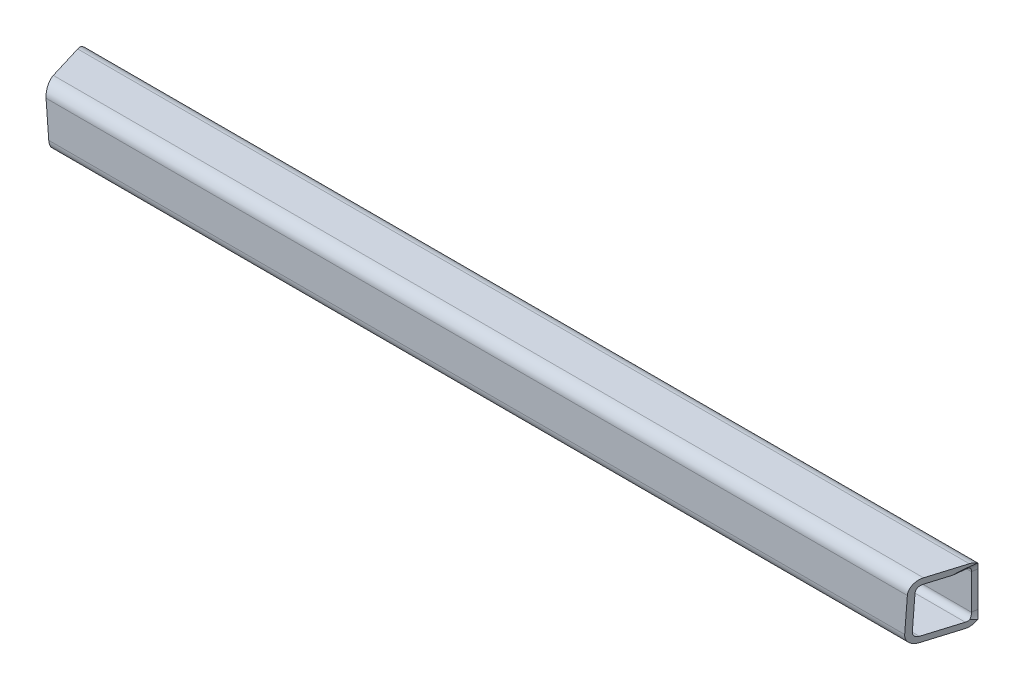
ISO-10303-21;
HEADER;
FILE_DESCRIPTION(('STEP AP214'),'2;1');
FILE_NAME('part.step','',(''),(''),'','','');
FILE_SCHEMA(('AUTOMOTIVE_DESIGN { 1 0 10303 214 1 1 1 1 }'));
ENDSEC;
DATA;
#1=APPLICATION_CONTEXT('core data for automotive mechanical design processes');
#2=APPLICATION_PROTOCOL_DEFINITION('international standard','automotive_design',2000,#1);
#3=PRODUCT_CONTEXT('',#1,'mechanical');
#4=PRODUCT('Part','Part','',(#3));
#5=PRODUCT_RELATED_PRODUCT_CATEGORY('part','',(#4));
#6=PRODUCT_DEFINITION_FORMATION('','',#4);
#7=PRODUCT_DEFINITION_CONTEXT('part definition',#1,'design');
#8=PRODUCT_DEFINITION('design','',#6,#7);
#9=PRODUCT_DEFINITION_SHAPE('','',#8);
#10=(LENGTH_UNIT() NAMED_UNIT(*) SI_UNIT(.MILLI.,.METRE.));
#11=(NAMED_UNIT(*) PLANE_ANGLE_UNIT() SI_UNIT($,.RADIAN.));
#12=(NAMED_UNIT(*) SI_UNIT($,.STERADIAN.) SOLID_ANGLE_UNIT());
#13=UNCERTAINTY_MEASURE_WITH_UNIT(LENGTH_MEASURE(1.E-05),#10,'distance_accuracy_value','');
#14=(GEOMETRIC_REPRESENTATION_CONTEXT(3) GLOBAL_UNCERTAINTY_ASSIGNED_CONTEXT((#13)) GLOBAL_UNIT_ASSIGNED_CONTEXT((#10,
#11,#12)) REPRESENTATION_CONTEXT('',''));
#15=CARTESIAN_POINT('',(0.,0.,0.));
#16=DIRECTION('',(0.,0.,1.));
#17=DIRECTION('',(1.,0.,0.));
#18=AXIS2_PLACEMENT_3D('',#15,#16,#17);
#19=CARTESIAN_POINT('',(-160.285714285715,6.00000000000003,-920.999999999999));
#20=DIRECTION('',(1.,0.,0.));
#21=DIRECTION('',(0.,1.,0.));
#22=AXIS2_PLACEMENT_3D('',#19,#20,#21);
#23=CYLINDRICAL_SURFACE('',#22,2.);
#24=DIRECTION('',(1.,0.,0.));
#25=VECTOR('',#24,1.);
#26=CARTESIAN_POINT('',(-160.285714285715,6.00000000000003,-922.999999999999));
#27=LINE('',#26,#25);
#28=CARTESIAN_POINT('',(-151.134905740681,6.00000000000001,-922.999999999999));
#29=VERTEX_POINT('',#28);
#30=CARTESIAN_POINT('',(151.13490574068,6.00000000000001,-922.999999999999));
#31=VERTEX_POINT('',#30);
#32=EDGE_CURVE('E226',#29,#31,#27,.T.);
#33=ORIENTED_EDGE('',*,*,#32,.T.);
#34=CARTESIAN_POINT('',(151.13490574068,6.00000000000001,-922.999999999999));
#35=CARTESIAN_POINT('',(151.134897059827,6.05419640564872,-923.00000751972));
#36=CARTESIAN_POINT('',(151.135762397031,6.10838772068273,-922.997797240482));
#37=CARTESIAN_POINT('',(151.139176480151,6.21634466272112,-922.988999579538));
#38=CARTESIAN_POINT('',(151.141724720267,6.27011041271801,-922.98241351298));
#39=CARTESIAN_POINT('',(151.148428023615,6.37664257140389,-922.964954042094));
#40=CARTESIAN_POINT('',(151.152577297065,6.42941187042656,-922.954096083372));
#41=CARTESIAN_POINT('',(151.162355513296,6.53376388752842,-922.928208961263));
#42=CARTESIAN_POINT('',(151.167984516834,6.58534655679074,-922.9131796266));
#43=CARTESIAN_POINT('',(151.186854651839,6.73771644841641,-922.862047647994));
#44=CARTESIAN_POINT('',(151.202090342615,6.83629511211455,-922.81987285929));
#45=CARTESIAN_POINT('',(151.236181038484,7.02499707587432,-922.720690858675));
#46=CARTESIAN_POINT('',(151.255039064201,7.1151132251054,-922.663671253645));
#47=CARTESIAN_POINT('',(151.295079291636,7.28857088229563,-922.533565402813));
#48=CARTESIAN_POINT('',(151.316326001025,7.3714658103511,-922.459902525123));
#49=CARTESIAN_POINT('',(151.357679010673,7.52413611556775,-922.299715109808));
#50=CARTESIAN_POINT('',(151.37778488278,7.59390658960106,-922.213185786973));
#51=CARTESIAN_POINT('',(151.41435947345,7.72046565481461,-922.026222269599));
#52=CARTESIAN_POINT('',(151.430694095417,7.77677758870827,-921.925436661786));
#53=CARTESIAN_POINT('',(151.455426889844,7.87139703455613,-921.714935880384));
#54=CARTESIAN_POINT('',(151.46383946791,7.90973716277423,-921.605237310595));
#55=CARTESIAN_POINT('',(151.469150778897,7.95877617584965,-921.412441799088));
#56=CARTESIAN_POINT('',(151.468635040142,7.97422767067173,-921.330606794626));
#57=CARTESIAN_POINT('',(151.463406923026,7.98969128993363,-921.207028806294));
#58=CARTESIAN_POINT('',(151.460915416117,7.99356021392647,-921.165642163092));
#59=CARTESIAN_POINT('',(151.454439009416,7.99871615520551,-921.082811844146));
#60=CARTESIAN_POINT('',(151.450453646466,8.00000237096007,-921.041368154691));
#61=CARTESIAN_POINT('',(151.445721087815,8.00000000000004,-920.999999999999));
#62=B_SPLINE_CURVE_WITH_KNOTS('',3,(#34,#35,#36,#37,#38,#39,#40,#41,#42,#43,#44,#45,#46,#47,#48,
#49,#50,#51,#52,#53,#54,#55,#56,#57,#58,#59,#60,#61),.UNSPECIFIED.,.F.,.F.,(4,2,2,2,2,2,2,2,2,2,
2,2,2,4),(0.,0.16252869645522,0.325008566785314,0.486906289594832,0.648810660860133,
0.972109124341931,1.29567836228111,1.63290689274576,1.97026115834366,2.31821291865465,
2.66553072757329,2.9145130908649,3.0393415756133,3.16420879432476),.UNSPECIFIED.);
#63=CARTESIAN_POINT('',(151.445721087815,8.00000000000004,-920.999999999999));
#64=VERTEX_POINT('',#63);
#65=EDGE_CURVE('E205',#31,#64,#62,.T.);
#66=ORIENTED_EDGE('',*,*,#65,.T.);
#67=DIRECTION('',(1.,0.,0.));
#68=VECTOR('',#67,1.);
#69=CARTESIAN_POINT('',(-160.285714285715,8.00000000000004,-920.999999999999));
#70=LINE('',#69,#68);
#71=CARTESIAN_POINT('',(-151.445721087815,8.00000000000004,-920.999999999999));
#72=VERTEX_POINT('',#71);
#73=EDGE_CURVE('E248',#72,#64,#70,.T.);
#74=ORIENTED_EDGE('',*,*,#73,.F.);
#75=CARTESIAN_POINT('',(-151.445721087815,8.00000000000004,-920.999999999999));
#76=CARTESIAN_POINT('',(-151.451517129834,8.00000903572294,-921.050589117872));
#77=CARTESIAN_POINT('',(-151.45618387766,7.99808071534614,-921.101305996992));
#78=CARTESIAN_POINT('',(-151.463283833278,7.99035879422783,-921.202585899075));
#79=CARTESIAN_POINT('',(-151.465717731673,7.98456638957483,-921.253148964786));
#80=CARTESIAN_POINT('',(-151.46837394052,7.96916428843077,-921.353492426546));
#81=CARTESIAN_POINT('',(-151.468607236734,7.95957380313401,-921.403275470431));
#82=CARTESIAN_POINT('',(-151.467019091782,7.93665621860682,-921.501927058206));
#83=CARTESIAN_POINT('',(-151.465197604561,7.92332903562757,-921.550795581575));
#84=CARTESIAN_POINT('',(-151.456913414074,7.87791364263258,-921.695428266285));
#85=CARTESIAN_POINT('',(-151.447634232296,7.84036617809091,-921.789383599776));
#86=CARTESIAN_POINT('',(-151.423542569026,7.75191664238408,-921.970020905703));
#87=CARTESIAN_POINT('',(-151.40872378646,7.70099938331442,-922.056694457378));
#88=CARTESIAN_POINT('',(-151.374955334016,7.58407292875091,-922.225481719183));
#89=CARTESIAN_POINT('',(-151.35582626498,7.51739897642207,-922.307098967391));
#90=CARTESIAN_POINT('',(-151.316561960971,7.37222994092314,-922.458772455435));
#91=CARTESIAN_POINT('',(-151.296426360285,7.29373053992197,-922.528824452782));
#92=CARTESIAN_POINT('',(-151.255880556745,7.11941127015457,-922.661288941842));
#93=CARTESIAN_POINT('',(-151.235590590544,7.0226887595338,-922.722557778644));
#94=CARTESIAN_POINT('',(-151.19926992651,6.81963269905309,-922.827914254527));
#95=CARTESIAN_POINT('',(-151.183235820798,6.71330693100691,-922.872015653719));
#96=CARTESIAN_POINT('',(-151.158965838382,6.50668154994383,-922.93742129344));
#97=CARTESIAN_POINT('',(-151.150040247101,6.40711762998516,-922.96077927195));
#98=CARTESIAN_POINT('',(-151.141012619842,6.25567479995235,-922.984252763148));
#99=CARTESIAN_POINT('',(-151.13873006506,6.20476261841694,-922.990150138339));
#100=CARTESIAN_POINT('',(-151.135674170797,6.10257436977137,-922.998025381361));
#101=CARTESIAN_POINT('',(-151.134901330089,6.05129818801775,-923.000001953857));
#102=CARTESIAN_POINT('',(-151.134905740681,6.00000000000001,-922.999999999999));
#103=B_SPLINE_CURVE_WITH_KNOTS('',3,(#75,#76,#77,#78,#79,#80,#81,#82,#83,#84,#85,#86,#87,#88,
#89,#90,#91,#92,#93,#94,#95,#96,#97,#98,#99,#100,#101,#102),.UNSPECIFIED.,.F.,.F.,(4,2,2,2,2,2,
2,2,2,2,2,2,2,4),(0.,0.152708033212283,0.305368819104958,0.45726709191222,0.609168769414979,
0.912480430850225,1.21613815216217,1.53613858551101,1.85625614523143,2.20338957179243,
2.55024418688331,2.85678919151711,3.01054619178082,3.16435398099613),.UNSPECIFIED.);
#104=EDGE_CURVE('E338',#72,#29,#103,.T.);
#105=ORIENTED_EDGE('',*,*,#104,.T.);
#106=EDGE_LOOP('',(#33,#66,#74,#105));
#107=FACE_BOUND('',#106,.T.);
#108=ADVANCED_FACE('F41',(#107),#23,.F.);
#109=CARTESIAN_POINT('',(-160.285714285715,6.00000000000003,-920.999999999999));
#110=DIRECTION('',(1.,0.,0.));
#111=DIRECTION('',(0.,1.,0.));
#112=AXIS2_PLACEMENT_3D('',#109,#110,#111);
#113=CYLINDRICAL_SURFACE('',#112,4.);
#114=CARTESIAN_POINT('',(154.932372015837,6.00000000000002,-920.999999999999));
#115=DIRECTION('',(0.74617243019316,0.,-0.665752735195008));
#116=DIRECTION('',(0.665752735195008,0.,0.74617243019316));
#117=AXIS2_PLACEMENT_3D('',#114,#115,#116);
#118=ELLIPSE('',#117,5.36069122650985,4.);
#119=CARTESIAN_POINT('',(151.363477169252,6.00000000000001,-924.999999999999));
#120=VERTEX_POINT('',#119);
#121=CARTESIAN_POINT('',(153.006385328775,9.36753446588342,-923.158636518982));
#122=VERTEX_POINT('',#121);
#123=EDGE_CURVE('E274',#120,#122,#118,.T.);
#124=ORIENTED_EDGE('',*,*,#123,.F.);
#125=DIRECTION('',(1.,0.,0.));
#126=VECTOR('',#125,1.);
#127=CARTESIAN_POINT('',(-160.285714285715,6.00000000000003,-924.999999999999));
#128=LINE('',#127,#126);
#129=CARTESIAN_POINT('',(-151.363477169252,6.00000000000001,-925.));
#130=VERTEX_POINT('',#129);
#131=EDGE_CURVE('E204',#130,#120,#128,.T.);
#132=ORIENTED_EDGE('',*,*,#131,.F.);
#133=CARTESIAN_POINT('',(-154.932372015837,6.00000000000002,-920.999999999999));
#134=DIRECTION('',(0.74617243019316,0.,0.665752735195008));
#135=DIRECTION('',(0.665752735195008,0.,-0.74617243019316));
#136=AXIS2_PLACEMENT_3D('',#133,#134,#135);
#137=ELLIPSE('',#136,5.36069122650985,4.);
#138=CARTESIAN_POINT('',(-153.006385328775,9.36753446588327,-923.158636518983));
#139=VERTEX_POINT('',#138);
#140=EDGE_CURVE('E345',#139,#130,#137,.F.);
#141=ORIENTED_EDGE('',*,*,#140,.F.);
#142=CARTESIAN_POINT('',(-152.091058034834,6.00000000000003,-920.999999999999));
#143=DIRECTION('',(-0.954065398667244,-0.0730777748475656,0.29054922799629));
#144=DIRECTION('',(0.299598423003046,-0.232714764299507,0.925248411731203));
#145=AXIS2_PLACEMENT_3D('',#142,#143,#144);
#146=ELLIPSE('',#145,4.19258470707322,4.);
#147=CARTESIAN_POINT('',(-152.397442796087,10.,-920.999999999999));
#148=VERTEX_POINT('',#147);
#149=EDGE_CURVE('E230',#148,#139,#146,.T.);
#150=ORIENTED_EDGE('',*,*,#149,.F.);
#151=DIRECTION('',(1.,0.,0.));
#152=VECTOR('',#151,1.);
#153=CARTESIAN_POINT('',(-160.285714285715,10.,-920.999999999999));
#154=LINE('',#153,#152);
#155=CARTESIAN_POINT('',(152.397442796087,10.,-920.999999999999));
#156=VERTEX_POINT('',#155);
#157=EDGE_CURVE('E213',#148,#156,#154,.T.);
#158=ORIENTED_EDGE('',*,*,#157,.T.);
#159=CARTESIAN_POINT('',(152.091058034834,6.00000000000003,-920.999999999999));
#160=DIRECTION('',(0.954065398667245,-0.0730777748475653,0.290549227996289));
#161=DIRECTION('',(0.299598423003044,0.232714764299507,-0.925248411731203));
#162=AXIS2_PLACEMENT_3D('',#159,#160,#161);
#163=ELLIPSE('',#162,4.19258470707322,4.);
#164=EDGE_CURVE('E283',#122,#156,#163,.T.);
#165=ORIENTED_EDGE('',*,*,#164,.F.);
#166=EDGE_LOOP('',(#124,#132,#141,#150,#158,#165));
#167=FACE_BOUND('',#166,.T.);
#168=ADVANCED_FACE('F425',(#167),#113,.T.);
#169=CARTESIAN_POINT('',(-160.285714285715,-5.99999999999998,-920.999999999999));
#170=DIRECTION('',(1.,0.,0.));
#171=DIRECTION('',(0.,1.,0.));
#172=AXIS2_PLACEMENT_3D('',#169,#170,#171);
#173=CYLINDRICAL_SURFACE('',#172,4.);
#174=CARTESIAN_POINT('',(154.932372015837,-5.99999999999999,-920.999999999999));
#175=DIRECTION('',(0.74617243019316,0.,-0.665752735195008));
#176=DIRECTION('',(0.665752735195008,0.,0.74617243019316));
#177=AXIS2_PLACEMENT_3D('',#174,#175,#176);
#178=ELLIPSE('',#177,5.36069122650985,4.);
#179=CARTESIAN_POINT('',(151.998741926291,-8.27795234068853,-924.287998347558));
#180=VERTEX_POINT('',#179);
#181=CARTESIAN_POINT('',(151.363477169252,-6.00000000000001,-924.999999999999));
#182=VERTEX_POINT('',#181);
#183=EDGE_CURVE('E178',#180,#182,#178,.T.);
#184=ORIENTED_EDGE('',*,*,#183,.F.);
#185=CARTESIAN_POINT('',(151.171903751076,-5.99999999999998,-920.999999999999));
#186=DIRECTION('',(0.954065398667245,-0.0730777748475653,0.290549227996289));
#187=DIRECTION('',(0.299598423003044,0.232714764299507,-0.925248411731203));
#188=AXIS2_PLACEMENT_3D('',#185,#186,#187);
#189=ELLIPSE('',#188,4.19258470707322,4.);
#190=CARTESIAN_POINT('',(150.865518989823,-9.99999999999998,-920.999999999999));
#191=VERTEX_POINT('',#190);
#192=EDGE_CURVE('E263',#191,#180,#189,.T.);
#193=ORIENTED_EDGE('',*,*,#192,.F.);
#194=DIRECTION('',(1.,0.,0.));
#195=VECTOR('',#194,1.);
#196=CARTESIAN_POINT('',(-160.285714285715,-9.99999999999998,-920.999999999999));
#197=LINE('',#196,#195);
#198=CARTESIAN_POINT('',(-150.865518989823,-9.99999999999998,-920.999999999999));
#199=VERTEX_POINT('',#198);
#200=EDGE_CURVE('E211',#199,#191,#197,.T.);
#201=ORIENTED_EDGE('',*,*,#200,.F.);
#202=CARTESIAN_POINT('',(-151.171903751076,-5.99999999999998,-920.999999999999));
#203=DIRECTION('',(-0.954065398667244,-0.0730777748475656,0.29054922799629));
#204=DIRECTION('',(0.299598423003046,-0.232714764299507,0.925248411731203));
#205=AXIS2_PLACEMENT_3D('',#202,#203,#204);
#206=ELLIPSE('',#205,4.19258470707322,4.);
#207=CARTESIAN_POINT('',(-151.998741926291,-8.27795234068825,-924.287998347559));
#208=VERTEX_POINT('',#207);
#209=EDGE_CURVE('E365',#208,#199,#206,.T.);
#210=ORIENTED_EDGE('',*,*,#209,.F.);
#211=CARTESIAN_POINT('',(-154.932372015837,-5.99999999999999,-920.999999999999));
#212=DIRECTION('',(0.74617243019316,0.,0.665752735195008));
#213=DIRECTION('',(0.665752735195008,0.,-0.74617243019316));
#214=AXIS2_PLACEMENT_3D('',#211,#212,#213);
#215=ELLIPSE('',#214,5.36069122650985,4.);
#216=CARTESIAN_POINT('',(-151.363477169252,-6.00000000000001,-924.999999999999));
#217=VERTEX_POINT('',#216);
#218=EDGE_CURVE('E210',#217,#208,#215,.F.);
#219=ORIENTED_EDGE('',*,*,#218,.F.);
#220=DIRECTION('',(1.,0.,0.));
#221=VECTOR('',#220,1.);
#222=CARTESIAN_POINT('',(-160.285714285715,-5.99999999999998,-924.999999999999));
#223=LINE('',#222,#221);
#224=EDGE_CURVE('E202',#217,#182,#223,.T.);
#225=ORIENTED_EDGE('',*,*,#224,.T.);
#226=EDGE_LOOP('',(#184,#193,#201,#210,#219,#225));
#227=FACE_BOUND('',#226,.T.);
#228=ADVANCED_FACE('F208',(#227),#173,.T.);
#229=CARTESIAN_POINT('',(-160.285714285715,8.00000000000004,-908.999999999999));
#230=DIRECTION('',(0.,-1.,0.));
#231=DIRECTION('',(1.,0.,0.));
#232=AXIS2_PLACEMENT_3D('',#229,#230,#231);
#233=PLANE('',#232);
#234=ORIENTED_EDGE('',*,*,#73,.T.);
#235=DIRECTION('',(-0.113546591160732,0.,0.993532672656404));
#236=VECTOR('',#235,1.);
#237=CARTESIAN_POINT('',(240.59710582802,8.00000000000004,-1701.0746164768));
#238=LINE('',#237,#236);
#239=CARTESIAN_POINT('',(150.966039783215,8.00000000000004,-916.802788584759));
#240=VERTEX_POINT('',#239);
#241=EDGE_CURVE('E11',#64,#240,#238,.T.);
#242=ORIENTED_EDGE('',*,*,#241,.T.);
#243=DIRECTION('',(-0.291328168163365,0.,0.956623174732129));
#244=VECTOR('',#243,1.);
#245=CARTESIAN_POINT('',(122.374880183697,8.00000000000004,-822.919090218778));
#246=LINE('',#245,#244);
#247=CARTESIAN_POINT('',(148.589793665613,8.00000000000004,-908.999999999999));
#248=VERTEX_POINT('',#247);
#249=EDGE_CURVE('E270',#240,#248,#246,.T.);
#250=ORIENTED_EDGE('',*,*,#249,.T.);
#251=DIRECTION('',(1.,0.,0.));
#252=VECTOR('',#251,1.);
#253=CARTESIAN_POINT('',(-160.285714285715,8.00000000000004,-908.999999999999));
#254=LINE('',#253,#252);
#255=CARTESIAN_POINT('',(-148.589793665613,8.00000000000004,-908.999999999999));
#256=VERTEX_POINT('',#255);
#257=EDGE_CURVE('E245',#256,#248,#254,.T.);
#258=ORIENTED_EDGE('',*,*,#257,.F.);
#259=DIRECTION('',(-0.291328168163367,0.,-0.956623174732129));
#260=VECTOR('',#259,1.);
#261=CARTESIAN_POINT('',(-149.582451028384,8.00000000000004,-912.259551054678));
#262=LINE('',#261,#260);
#263=CARTESIAN_POINT('',(-150.966039783218,8.00000000000004,-916.802788584771));
#264=VERTEX_POINT('',#263);
#265=EDGE_CURVE('E357',#256,#264,#262,.T.);
#266=ORIENTED_EDGE('',*,*,#265,.T.);
#267=DIRECTION('',(0.113546591160732,0.,0.993532672656404));
#268=VECTOR('',#267,1.);
#269=CARTESIAN_POINT('',(-240.597105828021,8.00000000000004,-1701.0746164768));
#270=LINE('',#269,#268);
#271=EDGE_CURVE('E314',#264,#72,#270,.F.);
#272=ORIENTED_EDGE('',*,*,#271,.T.);
#273=EDGE_LOOP('',(#234,#242,#250,#258,#266,#272));
#274=FACE_BOUND('',#273,.T.);
#275=ADVANCED_FACE('F419',(#274),#233,.T.);
#276=CARTESIAN_POINT('',(-160.285714285715,-5.99999999999998,-920.999999999999));
#277=DIRECTION('',(1.,0.,0.));
#278=DIRECTION('',(0.,1.,0.));
#279=AXIS2_PLACEMENT_3D('',#276,#277,#278);
#280=CYLINDRICAL_SURFACE('',#279,2.);
#281=CARTESIAN_POINT('',(151.171903751076,-5.99999999999998,-920.999999999999));
#282=DIRECTION('',(0.954065398667245,-0.0730777748475653,0.290549227996289));
#283=DIRECTION('',(0.299598423003044,0.232714764299507,-0.925248411731203));
#284=AXIS2_PLACEMENT_3D('',#281,#282,#283);
#285=ELLIPSE('',#284,2.09629235353661,2.);
#286=CARTESIAN_POINT('',(151.018711370449,-7.99999999999998,-920.999999999999));
#287=VERTEX_POINT('',#286);
#288=CARTESIAN_POINT('',(151.392469811754,-7.64471841513553,-922.137937315897));
#289=VERTEX_POINT('',#288);
#290=EDGE_CURVE('E262',#287,#289,#285,.T.);
#291=ORIENTED_EDGE('',*,*,#290,.T.);
#292=CARTESIAN_POINT('',(151.445721087815,-7.99999999999998,-920.999999999999));
#293=CARTESIAN_POINT('',(151.451517129834,-8.00000903572288,-921.050589117872));
#294=CARTESIAN_POINT('',(151.456183877659,-7.99808071534609,-921.101305996992));
#295=CARTESIAN_POINT('',(151.463283833277,-7.99035879422777,-921.202585899075));
#296=CARTESIAN_POINT('',(151.465717731673,-7.98456638957477,-921.253148964786));
#297=CARTESIAN_POINT('',(151.46837394052,-7.9691642884307,-921.353492426546));
#298=CARTESIAN_POINT('',(151.468607236733,-7.95957380313394,-921.403275470431));
#299=CARTESIAN_POINT('',(151.467019091782,-7.93665621860676,-921.501927058206));
#300=CARTESIAN_POINT('',(151.465197604561,-7.92332903562752,-921.550795581575));
#301=CARTESIAN_POINT('',(151.456913414074,-7.87791364263253,-921.695428266285));
#302=CARTESIAN_POINT('',(151.447634232296,-7.84036617809086,-921.789383599776));
#303=CARTESIAN_POINT('',(151.423542569026,-7.75191664238402,-921.970020905703));
#304=CARTESIAN_POINT('',(151.408723786459,-7.70099938331436,-922.056694457378));
#305=CARTESIAN_POINT('',(151.374955334015,-7.58407292875085,-922.225481719183));
#306=CARTESIAN_POINT('',(151.355826264979,-7.51739897642201,-922.307098967391));
#307=CARTESIAN_POINT('',(151.316561960971,-7.37222994092308,-922.458772455435));
#308=CARTESIAN_POINT('',(151.296426360284,-7.29373053992191,-922.528824452782));
#309=CARTESIAN_POINT('',(151.255880556745,-7.11941127015451,-922.661288941842));
#310=CARTESIAN_POINT('',(151.235590590544,-7.02268875953375,-922.722557778644));
#311=CARTESIAN_POINT('',(151.19926992651,-6.81963269905303,-922.827914254527));
#312=CARTESIAN_POINT('',(151.183235820797,-6.71330693100685,-922.872015653719));
#313=CARTESIAN_POINT('',(151.158965838382,-6.50668154994377,-922.93742129344));
#314=CARTESIAN_POINT('',(151.150040247101,-6.4071176299851,-922.96077927195));
#315=CARTESIAN_POINT('',(151.141012619842,-6.25567479995229,-922.984252763148));
#316=CARTESIAN_POINT('',(151.13873006506,-6.20476261841688,-922.990150138339));
#317=CARTESIAN_POINT('',(151.135674170797,-6.10257436977131,-922.998025381361));
#318=CARTESIAN_POINT('',(151.134901330089,-6.05129818801769,-923.000001953857));
#319=CARTESIAN_POINT('',(151.13490574068,-5.99999999999995,-922.999999999999));
#320=B_SPLINE_CURVE_WITH_KNOTS('',3,(#292,#293,#294,#295,#296,#297,#298,#299,#300,#301,#302,
#303,#304,#305,#306,#307,#308,#309,#310,#311,#312,#313,#314,#315,#316,#317,#318,#319),
.UNSPECIFIED.,.F.,.F.,(4,2,2,2,2,2,2,2,2,2,2,2,2,4),(0.,0.152708033212293,0.305368819105079,
0.457267091912229,0.609168769414989,0.912480430850233,1.21613815216217,1.53613858551102,
1.85625614523143,2.20338957179243,2.55024418688331,2.85678919151712,3.01054619178083,
3.16435398099614),.UNSPECIFIED.);
#321=CARTESIAN_POINT('',(151.13490574068,-6.00000000000001,-922.999999999999));
#322=VERTEX_POINT('',#321);
#323=EDGE_CURVE('E56',#289,#322,#320,.T.);
#324=ORIENTED_EDGE('',*,*,#323,.T.);
#325=DIRECTION('',(1.,0.,0.));
#326=VECTOR('',#325,1.);
#327=CARTESIAN_POINT('',(-160.285714285715,-5.99999999999998,-922.999999999999));
#328=LINE('',#327,#326);
#329=CARTESIAN_POINT('',(-151.134905740681,-6.00000000000001,-922.999999999999));
#330=VERTEX_POINT('',#329);
#331=EDGE_CURVE('E229',#330,#322,#328,.T.);
#332=ORIENTED_EDGE('',*,*,#331,.F.);
#333=CARTESIAN_POINT('',(-151.134905740681,-5.99999999999998,-922.999999999999));
#334=CARTESIAN_POINT('',(-151.134897059827,-6.05419640564869,-923.00000751972));
#335=CARTESIAN_POINT('',(-151.135762397032,-6.1083877206827,-922.997797240482));
#336=CARTESIAN_POINT('',(-151.139176480152,-6.2163446627211,-922.988999579538));
#337=CARTESIAN_POINT('',(-151.141724720267,-6.270110412718,-922.98241351298));
#338=CARTESIAN_POINT('',(-151.148428023615,-6.37664257140387,-922.964954042094));
#339=CARTESIAN_POINT('',(-151.152577297065,-6.42941187042655,-922.954096083372));
#340=CARTESIAN_POINT('',(-151.162355513296,-6.5337638875284,-922.928208961263));
#341=CARTESIAN_POINT('',(-151.167984516834,-6.58534655679071,-922.9131796266));
#342=CARTESIAN_POINT('',(-151.18685465184,-6.73771644841637,-922.862047647994));
#343=CARTESIAN_POINT('',(-151.202090342615,-6.83629511211451,-922.81987285929));
#344=CARTESIAN_POINT('',(-151.236181038485,-7.02499707587428,-922.720690858675));
#345=CARTESIAN_POINT('',(-151.255039064202,-7.11511322510535,-922.663671253645));
#346=CARTESIAN_POINT('',(-151.295079291636,-7.28857088229559,-922.533565402813));
#347=CARTESIAN_POINT('',(-151.316326001025,-7.37146581035107,-922.459902525123));
#348=CARTESIAN_POINT('',(-151.357679010673,-7.52413611556771,-922.299715109808));
#349=CARTESIAN_POINT('',(-151.37778488278,-7.59390658960101,-922.213185786973));
#350=CARTESIAN_POINT('',(-151.414359473451,-7.72046565481455,-922.026222269599));
#351=CARTESIAN_POINT('',(-151.430694095418,-7.77677758870823,-921.925436661786));
#352=CARTESIAN_POINT('',(-151.455426889844,-7.87139703455608,-921.714935880384));
#353=CARTESIAN_POINT('',(-151.463839467911,-7.90973716277417,-921.605237310595));
#354=CARTESIAN_POINT('',(-151.469150778897,-7.95877617584959,-921.412441799088));
#355=CARTESIAN_POINT('',(-151.468635040142,-7.97422767067167,-921.330606794626));
#356=CARTESIAN_POINT('',(-151.463406923026,-7.98969128993358,-921.207028806294));
#357=CARTESIAN_POINT('',(-151.460915416118,-7.99356021392642,-921.165642163092));
#358=CARTESIAN_POINT('',(-151.454439009416,-7.99871615520545,-921.082811844146));
#359=CARTESIAN_POINT('',(-151.450453646466,-8.00000237096001,-921.041368154691));
#360=CARTESIAN_POINT('',(-151.445721087815,-7.99999999999998,-920.999999999999));
#361=B_SPLINE_CURVE_WITH_KNOTS('',3,(#333,#334,#335,#336,#337,#338,#339,#340,#341,#342,#343,
#344,#345,#346,#347,#348,#349,#350,#351,#352,#353,#354,#355,#356,#357,#358,#359,#360),
.UNSPECIFIED.,.F.,.F.,(4,2,2,2,2,2,2,2,2,2,2,2,2,4),(0.,0.162528696455236,0.325008566785325,
0.486906289594831,0.648810660860126,0.972109124341905,1.29567836228109,1.63290689274575,
1.97026115834364,2.31821291865462,2.66553072757326,2.91451309086487,3.03934157561339,
3.16420879432473),.UNSPECIFIED.);
#362=CARTESIAN_POINT('',(-151.392469811754,-7.64471841513518,-922.137937315898));
#363=VERTEX_POINT('',#362);
#364=EDGE_CURVE('E305',#330,#363,#361,.T.);
#365=ORIENTED_EDGE('',*,*,#364,.T.);
#366=CARTESIAN_POINT('',(-151.171903751076,-5.99999999999998,-920.999999999999));
#367=DIRECTION('',(-0.954065398667244,-0.0730777748475656,0.29054922799629));
#368=DIRECTION('',(0.299598423003046,-0.232714764299507,0.925248411731203));
#369=AXIS2_PLACEMENT_3D('',#366,#367,#368);
#370=ELLIPSE('',#369,2.09629235353661,2.);
#371=CARTESIAN_POINT('',(-151.018711370449,-7.99999999999998,-920.999999999999));
#372=VERTEX_POINT('',#371);
#373=EDGE_CURVE('E352',#363,#372,#370,.T.);
#374=ORIENTED_EDGE('',*,*,#373,.T.);
#375=DIRECTION('',(1.,0.,0.));
#376=VECTOR('',#375,1.);
#377=CARTESIAN_POINT('',(-160.285714285715,-7.99999999999998,-920.999999999999));
#378=LINE('',#377,#376);
#379=EDGE_CURVE('E233',#372,#287,#378,.T.);
#380=ORIENTED_EDGE('',*,*,#379,.T.);
#381=EDGE_LOOP('',(#291,#324,#332,#365,#374,#380));
#382=FACE_BOUND('',#381,.T.);
#383=ADVANCED_FACE('F265',(#382),#280,.F.);
#384=CARTESIAN_POINT('',(-244.038803964062,-6.00000000000001,-1700.68127954697));
#385=DIRECTION('',(0.113546591160732,0.,0.993532672656404));
#386=DIRECTION('',(0.993532672656404,0.,-0.113546591160732));
#387=AXIS2_PLACEMENT_3D('',#384,#385,#386);
#388=CYLINDRICAL_SURFACE('',#387,4.);
#389=DIRECTION('',(0.113546591160732,0.,0.993532672656404));
#390=VECTOR('',#389,1.);
#391=CARTESIAN_POINT('',(-240.064673273436,-6.00000000000001,-1701.13546591161));
#392=LINE('',#391,#390);
#393=EDGE_CURVE('E298',#217,#330,#392,.T.);
#394=ORIENTED_EDGE('',*,*,#393,.F.);
#395=ORIENTED_EDGE('',*,*,#218,.T.);
#396=CARTESIAN_POINT('',(-157.191307612425,-6.00000000000001,-940.765686470145));
#397=DIRECTION('',(-0.954065398667244,-0.0730777748475656,0.29054922799629));
#398=DIRECTION('',(0.290362707329467,0.0133984681433684,0.956822856773245));
#399=AXIS2_PLACEMENT_3D('',#396,#397,#398);
#400=ELLIPSE('',#399,22.1804149414023,4.);
#401=EDGE_CURVE('E253',#363,#208,#400,.F.);
#402=ORIENTED_EDGE('',*,*,#401,.F.);
#403=ORIENTED_EDGE('',*,*,#364,.F.);
#404=EDGE_LOOP('',(#394,#395,#402,#403));
#405=FACE_BOUND('',#404,.T.);
#406=ADVANCED_FACE('F319',(#405),#388,.F.);
#407=CARTESIAN_POINT('',(-100.020879364242,-73.9667828296152,-770.132067830907));
#408=DIRECTION('',(-0.954065398667244,-0.0730777748475656,0.29054922799629));
#409=DIRECTION('',(0.291328168163367,0.,0.956623174732129));
#410=AXIS2_PLACEMENT_3D('',#407,#408,#409);
#411=PLANE('',#410);
#412=ORIENTED_EDGE('',*,*,#149,.T.);
#413=CARTESIAN_POINT('',(-156.639166181052,6.00000000000001,-935.93444894563));
#414=DIRECTION('',(-0.954065398667244,-0.0730777748475656,0.29054922799629));
#415=DIRECTION('',(0.290362707329467,0.0133984681433684,0.956822856773245));
#416=AXIS2_PLACEMENT_3D('',#413,#414,#415);
#417=ELLIPSE('',#416,22.1804149414023,4.);
#418=EDGE_CURVE('E256',#139,#264,#417,.F.);
#419=ORIENTED_EDGE('',*,*,#418,.T.);
#420=ORIENTED_EDGE('',*,*,#265,.F.);
#421=CARTESIAN_POINT('',(-148.436601284987,6.00000000000003,-908.999999999999));
#422=DIRECTION('',(-0.954065398667244,-0.0730777748475656,0.29054922799629));
#423=DIRECTION('',(0.299598423003046,-0.232714764299507,0.925248411731203));
#424=AXIS2_PLACEMENT_3D('',#421,#422,#423);
#425=ELLIPSE('',#424,2.09629235353661,2.);
#426=CARTESIAN_POINT('',(-147.827525160012,6.00000000000003,-906.999999999999));
#427=VERTEX_POINT('',#426);
#428=EDGE_CURVE('E354',#427,#256,#425,.T.);
#429=ORIENTED_EDGE('',*,*,#428,.F.);
#430=DIRECTION('',(-0.0763724801905252,0.997079357057174,0.));
#431=VECTOR('',#430,1.);
#432=CARTESIAN_POINT('',(-147.900190734026,6.94868391909392,-906.999999999999));
#433=LINE('',#432,#431);
#434=CARTESIAN_POINT('',(-146.908370876254,-5.99999999999998,-906.999999999999));
#435=VERTEX_POINT('',#434);
#436=EDGE_CURVE('E378',#435,#427,#433,.T.);
#437=ORIENTED_EDGE('',*,*,#436,.F.);
#438=CARTESIAN_POINT('',(-147.517447001228,-5.99999999999998,-908.999999999999));
#439=DIRECTION('',(-0.954065398667244,-0.0730777748475656,0.29054922799629));
#440=DIRECTION('',(0.299598423003046,-0.232714764299507,0.925248411731203));
#441=AXIS2_PLACEMENT_3D('',#438,#439,#440);
#442=ELLIPSE('',#441,2.09629235353661,2.);
#443=CARTESIAN_POINT('',(-147.364254620602,-7.99999999999998,-908.999999999999));
#444=VERTEX_POINT('',#443);
#445=EDGE_CURVE('E375',#444,#435,#442,.T.);
#446=ORIENTED_EDGE('',*,*,#445,.F.);
#447=DIRECTION('',(0.291328168163367,0.,0.956623174732129));
#448=VECTOR('',#447,1.);
#449=CARTESIAN_POINT('',(-151.805221383081,-7.99999999999998,-923.582632877505));
#450=LINE('',#449,#448);
#451=EDGE_CURVE('E372',#372,#444,#450,.T.);
#452=ORIENTED_EDGE('',*,*,#451,.F.);
#453=ORIENTED_EDGE('',*,*,#373,.F.);
#454=ORIENTED_EDGE('',*,*,#401,.T.);
#455=ORIENTED_EDGE('',*,*,#209,.T.);
#456=DIRECTION('',(0.291328168163367,0.,0.956623174732129));
#457=VECTOR('',#456,1.);
#458=CARTESIAN_POINT('',(-151.665030761742,-9.99999999999998,-923.625326257706));
#459=LINE('',#458,#457);
#460=CARTESIAN_POINT('',(-147.211062239975,-9.99999999999998,-908.999999999999));
#461=VERTEX_POINT('',#460);
#462=EDGE_CURVE('E370',#199,#461,#459,.T.);
#463=ORIENTED_EDGE('',*,*,#462,.T.);
#464=CARTESIAN_POINT('',(-147.517447001228,-5.99999999999998,-908.999999999999));
#465=DIRECTION('',(-0.954065398667244,-0.0730777748475656,0.29054922799629));
#466=DIRECTION('',(0.299598423003046,-0.232714764299507,0.925248411731203));
#467=AXIS2_PLACEMENT_3D('',#464,#465,#466);
#468=ELLIPSE('',#467,4.19258470707322,4.);
#469=CARTESIAN_POINT('',(-146.299294751279,-5.99999999999998,-904.999999999999));
#470=VERTEX_POINT('',#469);
#471=EDGE_CURVE('E368',#461,#470,#468,.T.);
#472=ORIENTED_EDGE('',*,*,#471,.T.);
#473=DIRECTION('',(-0.0763724801905252,0.997079357057174,0.));
#474=VECTOR('',#473,1.);
#475=CARTESIAN_POINT('',(-147.29466720131,6.99506471484499,-904.999999999999));
#476=LINE('',#475,#474);
#477=CARTESIAN_POINT('',(-147.218449035038,6.00000000000003,-904.999999999999));
#478=VERTEX_POINT('',#477);
#479=EDGE_CURVE('E225',#470,#478,#476,.T.);
#480=ORIENTED_EDGE('',*,*,#479,.T.);
#481=CARTESIAN_POINT('',(-148.436601284987,6.00000000000003,-908.999999999999));
#482=DIRECTION('',(-0.954065398667244,-0.0730777748475656,0.29054922799629));
#483=DIRECTION('',(0.299598423003046,-0.232714764299507,0.925248411731203));
#484=AXIS2_PLACEMENT_3D('',#481,#482,#483);
#485=ELLIPSE('',#484,4.19258470707322,4.);
#486=CARTESIAN_POINT('',(-148.74298604624,10.,-908.999999999999));
#487=VERTEX_POINT('',#486);
#488=EDGE_CURVE('E360',#478,#487,#485,.T.);
#489=ORIENTED_EDGE('',*,*,#488,.T.);
#490=DIRECTION('',(-0.291328168163367,0.,-0.956623174732129));
#491=VECTOR('',#490,1.);
#492=CARTESIAN_POINT('',(-149.722641649722,10.,-912.216857674477));
#493=LINE('',#492,#491);
#494=EDGE_CURVE('E362',#487,#148,#493,.T.);
#495=ORIENTED_EDGE('',*,*,#494,.T.);
#496=EDGE_LOOP('',(#412,#419,#420,#429,#437,#446,#452,#453,#454,#455,#463,#472,#480,#489,#495));
#497=FACE_BOUND('',#496,.T.);
#498=ADVANCED_FACE('F324',(#497),#411,.T.);
#499=CARTESIAN_POINT('',(-244.038803964062,6.00000000000001,-1700.68127954697));
#500=DIRECTION('',(0.113546591160732,0.,0.993532672656404));
#501=DIRECTION('',(0.993532672656404,0.,-0.113546591160732));
#502=AXIS2_PLACEMENT_3D('',#499,#500,#501);
#503=CYLINDRICAL_SURFACE('',#502,4.);
#504=ORIENTED_EDGE('',*,*,#140,.T.);
#505=DIRECTION('',(0.113546591160732,0.,0.993532672656404));
#506=VECTOR('',#505,1.);
#507=CARTESIAN_POINT('',(-240.064673273436,6.00000000000001,-1701.13546591161));
#508=LINE('',#507,#506);
#509=EDGE_CURVE('E301',#130,#29,#508,.T.);
#510=ORIENTED_EDGE('',*,*,#509,.T.);
#511=ORIENTED_EDGE('',*,*,#104,.F.);
#512=ORIENTED_EDGE('',*,*,#271,.F.);
#513=ORIENTED_EDGE('',*,*,#418,.F.);
#514=EDGE_LOOP('',(#504,#510,#511,#512,#513));
#515=FACE_BOUND('',#514,.T.);
#516=ADVANCED_FACE('F331',(#515),#503,.F.);
#517=CARTESIAN_POINT('',(-240.064673273436,-6.00000000000001,-1701.13546591161));
#518=DIRECTION('',(-0.993532672656404,0.,0.113546591160732));
#519=DIRECTION('',(0.113546591160732,0.,0.993532672656404));
#520=AXIS2_PLACEMENT_3D('',#517,#518,#519);
#521=PLANE('',#520);
#522=ORIENTED_EDGE('',*,*,#509,.F.);
#523=DIRECTION('',(0.,-1.,0.));
#524=VECTOR('',#523,1.);
#525=CARTESIAN_POINT('',(-151.363477169252,-5.99999999999998,-924.999999999999));
#526=LINE('',#525,#524);
#527=EDGE_CURVE('E347',#130,#217,#526,.T.);
#528=ORIENTED_EDGE('',*,*,#527,.T.);
#529=ORIENTED_EDGE('',*,*,#393,.T.);
#530=DIRECTION('',(0.,-1.,0.));
#531=VECTOR('',#530,1.);
#532=CARTESIAN_POINT('',(-151.134905740681,-5.99999999999998,-922.999999999999));
#533=LINE('',#532,#531);
#534=EDGE_CURVE('E349',#29,#330,#533,.T.);
#535=ORIENTED_EDGE('',*,*,#534,.F.);
#536=EDGE_LOOP('',(#522,#528,#529,#535));
#537=FACE_BOUND('',#536,.T.);
#538=ADVANCED_FACE('F327',(#537),#521,.T.);
#539=CARTESIAN_POINT('',(-160.285714285715,-5.99999999999998,-908.999999999999));
#540=DIRECTION('',(1.,0.,0.));
#541=DIRECTION('',(0.,1.,0.));
#542=AXIS2_PLACEMENT_3D('',#539,#540,#541);
#543=CYLINDRICAL_SURFACE('',#542,4.);
#544=CARTESIAN_POINT('',(147.517447001228,-5.99999999999998,-908.999999999999));
#545=DIRECTION('',(0.954065398667245,-0.0730777748475653,0.290549227996289));
#546=DIRECTION('',(0.299598423003044,0.232714764299507,-0.925248411731203));
#547=AXIS2_PLACEMENT_3D('',#544,#545,#546);
#548=ELLIPSE('',#547,4.19258470707322,4.);
#549=CARTESIAN_POINT('',(146.299294751279,-5.99999999999998,-904.999999999999));
#550=VERTEX_POINT('',#549);
#551=CARTESIAN_POINT('',(147.211062239975,-9.99999999999998,-908.999999999999));
#552=VERTEX_POINT('',#551);
#553=EDGE_CURVE('E294',#550,#552,#548,.T.);
#554=ORIENTED_EDGE('',*,*,#553,.F.);
#555=DIRECTION('',(1.,0.,0.));
#556=VECTOR('',#555,1.);
#557=CARTESIAN_POINT('',(-160.285714285715,-5.99999999999998,-904.999999999999));
#558=LINE('',#557,#556);
#559=EDGE_CURVE('E384',#470,#550,#558,.T.);
#560=ORIENTED_EDGE('',*,*,#559,.F.);
#561=ORIENTED_EDGE('',*,*,#471,.F.);
#562=DIRECTION('',(1.,0.,0.));
#563=VECTOR('',#562,1.);
#564=CARTESIAN_POINT('',(-160.285714285715,-9.99999999999998,-908.999999999999));
#565=LINE('',#564,#563);
#566=EDGE_CURVE('E216',#461,#552,#565,.T.);
#567=ORIENTED_EDGE('',*,*,#566,.T.);
#568=EDGE_LOOP('',(#554,#560,#561,#567));
#569=FACE_BOUND('',#568,.T.);
#570=ADVANCED_FACE('F330',(#569),#543,.T.);
#571=CARTESIAN_POINT('',(-160.285714285715,-5.99999999999998,-908.999999999999));
#572=DIRECTION('',(1.,0.,0.));
#573=DIRECTION('',(0.,1.,0.));
#574=AXIS2_PLACEMENT_3D('',#571,#572,#573);
#575=CYLINDRICAL_SURFACE('',#574,2.);
#576=DIRECTION('',(1.,0.,0.));
#577=VECTOR('',#576,1.);
#578=CARTESIAN_POINT('',(-160.285714285715,-5.99999999999998,-906.999999999999));
#579=LINE('',#578,#577);
#580=CARTESIAN_POINT('',(146.908370876254,-5.99999999999998,-906.999999999999));
#581=VERTEX_POINT('',#580);
#582=EDGE_CURVE('E239',#435,#581,#579,.T.);
#583=ORIENTED_EDGE('',*,*,#582,.T.);
#584=CARTESIAN_POINT('',(147.517447001228,-5.99999999999998,-908.999999999999));
#585=DIRECTION('',(0.954065398667245,-0.0730777748475653,0.290549227996289));
#586=DIRECTION('',(0.299598423003044,0.232714764299507,-0.925248411731203));
#587=AXIS2_PLACEMENT_3D('',#584,#585,#586);
#588=ELLIPSE('',#587,2.09629235353661,2.);
#589=CARTESIAN_POINT('',(147.364254620602,-7.99999999999998,-908.999999999999));
#590=VERTEX_POINT('',#589);
#591=EDGE_CURVE('E287',#581,#590,#588,.T.);
#592=ORIENTED_EDGE('',*,*,#591,.T.);
#593=DIRECTION('',(1.,0.,0.));
#594=VECTOR('',#593,1.);
#595=CARTESIAN_POINT('',(-160.285714285715,-7.99999999999998,-908.999999999999));
#596=LINE('',#595,#594);
#597=EDGE_CURVE('E236',#444,#590,#596,.T.);
#598=ORIENTED_EDGE('',*,*,#597,.F.);
#599=ORIENTED_EDGE('',*,*,#445,.T.);
#600=EDGE_LOOP('',(#583,#592,#598,#599));
#601=FACE_BOUND('',#600,.T.);
#602=ADVANCED_FACE('F458',(#601),#575,.F.);
#603=CARTESIAN_POINT('',(100.897812662413,-84.5716616734341,-775.678916729018));
#604=DIRECTION('',(0.954065398667245,-0.0730777748475653,0.290549227996289));
#605=DIRECTION('',(0.291328168163365,0.,-0.956623174732129));
#606=AXIS2_PLACEMENT_3D('',#603,#604,#605);
#607=PLANE('',#606);
#608=DIRECTION('',(0.291328168163365,0.,-0.956623174732129));
#609=VECTOR('',#608,1.);
#610=CARTESIAN_POINT('',(124.457459917055,-9.99999999999998,-834.284865421806));
#611=LINE('',#610,#609);
#612=EDGE_CURVE('E296',#552,#191,#611,.T.);
#613=ORIENTED_EDGE('',*,*,#612,.T.);
#614=ORIENTED_EDGE('',*,*,#192,.T.);
#615=CARTESIAN_POINT('',(157.191307612425,-6.00000000000001,-940.765686470143));
#616=DIRECTION('',(0.954065398667245,-0.0730777748475653,0.290549227996289));
#617=DIRECTION('',(-0.290362707329465,0.0133984681433682,0.956822856773246));
#618=AXIS2_PLACEMENT_3D('',#615,#616,#617);
#619=ELLIPSE('',#618,22.1804149414025,4.);
#620=EDGE_CURVE('E49',#180,#289,#619,.F.);
#621=ORIENTED_EDGE('',*,*,#620,.T.);
#622=ORIENTED_EDGE('',*,*,#290,.F.);
#623=DIRECTION('',(0.291328168163365,0.,-0.956623174732129));
#624=VECTOR('',#623,1.);
#625=CARTESIAN_POINT('',(124.597650538394,-7.99999999999998,-834.242172041605));
#626=LINE('',#625,#624);
#627=EDGE_CURVE('E290',#590,#287,#626,.T.);
#628=ORIENTED_EDGE('',*,*,#627,.F.);
#629=ORIENTED_EDGE('',*,*,#591,.F.);
#630=DIRECTION('',(-0.0763724801905248,-0.997079357057174,0.));
#631=VECTOR('',#630,1.);
#632=CARTESIAN_POINT('',(146.030375897007,-17.4626455396342,-906.999999999999));
#633=LINE('',#632,#631);
#634=CARTESIAN_POINT('',(147.827525160012,6.00000000000003,-906.999999999999));
#635=VERTEX_POINT('',#634);
#636=EDGE_CURVE('E64',#635,#581,#633,.T.);
#637=ORIENTED_EDGE('',*,*,#636,.F.);
#638=CARTESIAN_POINT('',(148.436601284987,6.00000000000003,-908.999999999999));
#639=DIRECTION('',(0.954065398667245,-0.0730777748475653,0.290549227996289));
#640=DIRECTION('',(0.299598423003044,0.232714764299507,-0.925248411731203));
#641=AXIS2_PLACEMENT_3D('',#638,#639,#640);
#642=ELLIPSE('',#641,2.09629235353661,2.);
#643=EDGE_CURVE('E269',#248,#635,#642,.T.);
#644=ORIENTED_EDGE('',*,*,#643,.F.);
#645=ORIENTED_EDGE('',*,*,#249,.F.);
#646=CARTESIAN_POINT('',(156.639166181052,6.00000000000001,-935.934448945628));
#647=DIRECTION('',(0.954065398667245,-0.0730777748475653,0.290549227996289));
#648=DIRECTION('',(-0.290362707329465,0.0133984681433682,0.956822856773246));
#649=AXIS2_PLACEMENT_3D('',#646,#647,#648);
#650=ELLIPSE('',#649,22.1804149414025,4.);
#651=EDGE_CURVE('E429',#240,#122,#650,.F.);
#652=ORIENTED_EDGE('',*,*,#651,.T.);
#653=ORIENTED_EDGE('',*,*,#164,.T.);
#654=DIRECTION('',(-0.291328168163365,0.,0.956623174732129));
#655=VECTOR('',#654,1.);
#656=CARTESIAN_POINT('',(122.515070805035,10.,-822.876396838577));
#657=LINE('',#656,#655);
#658=CARTESIAN_POINT('',(148.742986046239,10.,-908.999999999999));
#659=VERTEX_POINT('',#658);
#660=EDGE_CURVE('E280',#156,#659,#657,.T.);
#661=ORIENTED_EDGE('',*,*,#660,.T.);
#662=CARTESIAN_POINT('',(148.436601284987,6.00000000000003,-908.999999999999));
#663=DIRECTION('',(0.954065398667245,-0.0730777748475653,0.290549227996289));
#664=DIRECTION('',(0.299598423003044,0.232714764299507,-0.925248411731203));
#665=AXIS2_PLACEMENT_3D('',#662,#663,#664);
#666=ELLIPSE('',#665,4.19258470707322,4.);
#667=CARTESIAN_POINT('',(147.218449035037,6.00000000000003,-904.999999999999));
#668=VERTEX_POINT('',#667);
#669=EDGE_CURVE('E272',#659,#668,#666,.T.);
#670=ORIENTED_EDGE('',*,*,#669,.T.);
#671=DIRECTION('',(-0.0763724801905248,-0.997079357057174,0.));
#672=VECTOR('',#671,1.);
#673=CARTESIAN_POINT('',(145.42485236429,-17.4162647438832,-904.999999999999));
#674=LINE('',#673,#672);
#675=EDGE_CURVE('E292',#668,#550,#674,.T.);
#676=ORIENTED_EDGE('',*,*,#675,.T.);
#677=ORIENTED_EDGE('',*,*,#553,.T.);
#678=EDGE_LOOP('',(#613,#614,#621,#622,#628,#629,#637,#644,#645,#652,#653,#661,#670,#676,#677));
#679=FACE_BOUND('',#678,.T.);
#680=ADVANCED_FACE('F261',(#679),#607,.T.);
#681=CARTESIAN_POINT('',(-160.285714285715,-9.99999999999998,-920.999999999999));
#682=DIRECTION('',(0.,1.,0.));
#683=DIRECTION('',(-1.,0.,0.));
#684=AXIS2_PLACEMENT_3D('',#681,#682,#683);
#685=PLANE('',#684);
#686=ORIENTED_EDGE('',*,*,#200,.T.);
#687=ORIENTED_EDGE('',*,*,#612,.F.);
#688=ORIENTED_EDGE('',*,*,#566,.F.);
#689=ORIENTED_EDGE('',*,*,#462,.F.);
#690=EDGE_LOOP('',(#686,#687,#688,#689));
#691=FACE_BOUND('',#690,.T.);
#692=ADVANCED_FACE('F394',(#691),#685,.F.);
#693=CARTESIAN_POINT('',(-160.285714285715,6.00000000000003,-908.999999999999));
#694=DIRECTION('',(1.,0.,0.));
#695=DIRECTION('',(0.,1.,0.));
#696=AXIS2_PLACEMENT_3D('',#693,#694,#695);
#697=CYLINDRICAL_SURFACE('',#696,2.);
#698=ORIENTED_EDGE('',*,*,#257,.T.);
#699=ORIENTED_EDGE('',*,*,#643,.T.);
#700=DIRECTION('',(1.,0.,0.));
#701=VECTOR('',#700,1.);
#702=CARTESIAN_POINT('',(-160.285714285715,6.00000000000003,-906.999999999999));
#703=LINE('',#702,#701);
#704=EDGE_CURVE('E242',#427,#635,#703,.T.);
#705=ORIENTED_EDGE('',*,*,#704,.F.);
#706=ORIENTED_EDGE('',*,*,#428,.T.);
#707=EDGE_LOOP('',(#698,#699,#705,#706));
#708=FACE_BOUND('',#707,.T.);
#709=ADVANCED_FACE('F452',(#708),#697,.F.);
#710=CARTESIAN_POINT('',(-160.285714285715,6.00000000000003,-906.999999999999));
#711=DIRECTION('',(0.,0.,-1.));
#712=DIRECTION('',(-1.,0.,0.));
#713=AXIS2_PLACEMENT_3D('',#710,#711,#712);
#714=PLANE('',#713);
#715=ORIENTED_EDGE('',*,*,#704,.T.);
#716=ORIENTED_EDGE('',*,*,#636,.T.);
#717=ORIENTED_EDGE('',*,*,#582,.F.);
#718=ORIENTED_EDGE('',*,*,#436,.T.);
#719=EDGE_LOOP('',(#715,#716,#717,#718));
#720=FACE_BOUND('',#719,.T.);
#721=ADVANCED_FACE('F459',(#720),#714,.T.);
#722=CARTESIAN_POINT('',(-160.285714285715,10.,-908.999999999999));
#723=DIRECTION('',(0.,-1.,0.));
#724=DIRECTION('',(1.,0.,0.));
#725=AXIS2_PLACEMENT_3D('',#722,#723,#724);
#726=PLANE('',#725);
#727=ORIENTED_EDGE('',*,*,#660,.F.);
#728=ORIENTED_EDGE('',*,*,#157,.F.);
#729=ORIENTED_EDGE('',*,*,#494,.F.);
#730=DIRECTION('',(1.,0.,0.));
#731=VECTOR('',#730,1.);
#732=CARTESIAN_POINT('',(-160.285714285715,10.,-908.999999999999));
#733=LINE('',#732,#731);
#734=EDGE_CURVE('E222',#487,#659,#733,.T.);
#735=ORIENTED_EDGE('',*,*,#734,.T.);
#736=EDGE_LOOP('',(#727,#728,#729,#735));
#737=FACE_BOUND('',#736,.T.);
#738=ADVANCED_FACE('F461',(#737),#726,.F.);
#739=CARTESIAN_POINT('',(-160.285714285715,6.00000000000003,-908.999999999999));
#740=DIRECTION('',(1.,0.,0.));
#741=DIRECTION('',(0.,1.,0.));
#742=AXIS2_PLACEMENT_3D('',#739,#740,#741);
#743=CYLINDRICAL_SURFACE('',#742,4.);
#744=ORIENTED_EDGE('',*,*,#669,.F.);
#745=ORIENTED_EDGE('',*,*,#734,.F.);
#746=ORIENTED_EDGE('',*,*,#488,.F.);
#747=DIRECTION('',(1.,0.,0.));
#748=VECTOR('',#747,1.);
#749=CARTESIAN_POINT('',(-160.285714285715,6.00000000000003,-904.999999999999));
#750=LINE('',#749,#748);
#751=EDGE_CURVE('E251',#478,#668,#750,.T.);
#752=ORIENTED_EDGE('',*,*,#751,.T.);
#753=EDGE_LOOP('',(#744,#745,#746,#752));
#754=FACE_BOUND('',#753,.T.);
#755=ADVANCED_FACE('F402',(#754),#743,.T.);
#756=CARTESIAN_POINT('',(-160.285714285715,6.00000000000003,-904.999999999999));
#757=DIRECTION('',(0.,0.,-1.));
#758=DIRECTION('',(-1.,0.,0.));
#759=AXIS2_PLACEMENT_3D('',#756,#757,#758);
#760=PLANE('',#759);
#761=ORIENTED_EDGE('',*,*,#675,.F.);
#762=ORIENTED_EDGE('',*,*,#751,.F.);
#763=ORIENTED_EDGE('',*,*,#479,.F.);
#764=ORIENTED_EDGE('',*,*,#559,.T.);
#765=EDGE_LOOP('',(#761,#762,#763,#764));
#766=FACE_BOUND('',#765,.T.);
#767=ADVANCED_FACE('F398',(#766),#760,.F.);
#768=CARTESIAN_POINT('',(-160.285714285715,-7.99999999999998,-920.999999999999));
#769=DIRECTION('',(0.,1.,0.));
#770=DIRECTION('',(-1.,0.,0.));
#771=AXIS2_PLACEMENT_3D('',#768,#769,#770);
#772=PLANE('',#771);
#773=ORIENTED_EDGE('',*,*,#627,.T.);
#774=ORIENTED_EDGE('',*,*,#379,.F.);
#775=ORIENTED_EDGE('',*,*,#451,.T.);
#776=ORIENTED_EDGE('',*,*,#597,.T.);
#777=EDGE_LOOP('',(#773,#774,#775,#776));
#778=FACE_BOUND('',#777,.T.);
#779=ADVANCED_FACE('F487',(#778),#772,.T.);
#780=CARTESIAN_POINT('',(-160.285714285715,-5.99999999999998,-924.999999999999));
#781=DIRECTION('',(0.,0.,1.));
#782=DIRECTION('',(1.,0.,0.));
#783=AXIS2_PLACEMENT_3D('',#780,#781,#782);
#784=PLANE('',#783);
#785=DIRECTION('',(0.,1.,0.));
#786=VECTOR('',#785,1.);
#787=CARTESIAN_POINT('',(151.363477169252,-5.99999999999998,-924.999999999999));
#788=LINE('',#787,#786);
#789=EDGE_CURVE('E192',#182,#120,#788,.T.);
#790=ORIENTED_EDGE('',*,*,#789,.F.);
#791=ORIENTED_EDGE('',*,*,#224,.F.);
#792=ORIENTED_EDGE('',*,*,#527,.F.);
#793=ORIENTED_EDGE('',*,*,#131,.T.);
#794=EDGE_LOOP('',(#790,#791,#792,#793));
#795=FACE_BOUND('',#794,.T.);
#796=ADVANCED_FACE('F200',(#795),#784,.F.);
#797=CARTESIAN_POINT('',(-160.285714285715,-5.99999999999998,-922.999999999999));
#798=DIRECTION('',(0.,0.,1.));
#799=DIRECTION('',(1.,0.,0.));
#800=AXIS2_PLACEMENT_3D('',#797,#798,#799);
#801=PLANE('',#800);
#802=ORIENTED_EDGE('',*,*,#331,.T.);
#803=DIRECTION('',(0.,1.,0.));
#804=VECTOR('',#803,1.);
#805=CARTESIAN_POINT('',(151.13490574068,-5.99999999999998,-922.999999999999));
#806=LINE('',#805,#804);
#807=EDGE_CURVE('E186',#322,#31,#806,.T.);
#808=ORIENTED_EDGE('',*,*,#807,.T.);
#809=ORIENTED_EDGE('',*,*,#32,.F.);
#810=ORIENTED_EDGE('',*,*,#534,.T.);
#811=EDGE_LOOP('',(#802,#808,#809,#810));
#812=FACE_BOUND('',#811,.T.);
#813=ADVANCED_FACE('F410',(#812),#801,.T.);
#814=CARTESIAN_POINT('',(244.038803964062,6.00000000000001,-1700.68127954696));
#815=DIRECTION('',(-0.113546591160732,0.,0.993532672656404));
#816=DIRECTION('',(0.993532672656404,0.,0.113546591160732));
#817=AXIS2_PLACEMENT_3D('',#814,#815,#816);
#818=CYLINDRICAL_SURFACE('',#817,4.);
#819=ORIENTED_EDGE('',*,*,#123,.T.);
#820=ORIENTED_EDGE('',*,*,#651,.F.);
#821=ORIENTED_EDGE('',*,*,#241,.F.);
#822=ORIENTED_EDGE('',*,*,#65,.F.);
#823=DIRECTION('',(-0.113546591160732,0.,0.993532672656404));
#824=VECTOR('',#823,1.);
#825=CARTESIAN_POINT('',(240.064673273436,6.00000000000001,-1701.13546591161));
#826=LINE('',#825,#824);
#827=EDGE_CURVE('E195',#120,#31,#826,.T.);
#828=ORIENTED_EDGE('',*,*,#827,.F.);
#829=EDGE_LOOP('',(#819,#820,#821,#822,#828));
#830=FACE_BOUND('',#829,.T.);
#831=ADVANCED_FACE('F438',(#830),#818,.F.);
#832=CARTESIAN_POINT('',(240.064673273436,6.00000000000001,-1701.13546591161));
#833=DIRECTION('',(0.993532672656404,0.,0.113546591160732));
#834=DIRECTION('',(0.113546591160732,0.,-0.993532672656404));
#835=AXIS2_PLACEMENT_3D('',#832,#833,#834);
#836=PLANE('',#835);
#837=ORIENTED_EDGE('',*,*,#789,.T.);
#838=ORIENTED_EDGE('',*,*,#827,.T.);
#839=ORIENTED_EDGE('',*,*,#807,.F.);
#840=DIRECTION('',(-0.113546591160732,0.,0.993532672656404));
#841=VECTOR('',#840,1.);
#842=CARTESIAN_POINT('',(240.064673273436,-6.00000000000001,-1701.13546591161));
#843=LINE('',#842,#841);
#844=EDGE_CURVE('E181',#182,#322,#843,.T.);
#845=ORIENTED_EDGE('',*,*,#844,.F.);
#846=EDGE_LOOP('',(#837,#838,#839,#845));
#847=FACE_BOUND('',#846,.T.);
#848=ADVANCED_FACE('F190',(#847),#836,.T.);
#849=CARTESIAN_POINT('',(244.038803964062,-6.00000000000001,-1700.68127954696));
#850=DIRECTION('',(-0.113546591160732,0.,0.993532672656404));
#851=DIRECTION('',(0.993532672656404,0.,0.113546591160732));
#852=AXIS2_PLACEMENT_3D('',#849,#850,#851);
#853=CYLINDRICAL_SURFACE('',#852,4.);
#854=ORIENTED_EDGE('',*,*,#183,.T.);
#855=ORIENTED_EDGE('',*,*,#844,.T.);
#856=ORIENTED_EDGE('',*,*,#323,.F.);
#857=ORIENTED_EDGE('',*,*,#620,.F.);
#858=EDGE_LOOP('',(#854,#855,#856,#857));
#859=FACE_BOUND('',#858,.T.);
#860=ADVANCED_FACE('F180',(#859),#853,.F.);
#861=CLOSED_SHELL('',(#108,#168,#228,#275,#383,#406,#498,#516,#538,#570,#602,#680,#692,#709,
#721,#738,#755,#767,#779,#796,#813,#831,#848,#860));
#862=MANIFOLD_SOLID_BREP('B2',#861);
#863=ADVANCED_BREP_SHAPE_REPRESENTATION('',(#18,#862),#14);
#864=SHAPE_DEFINITION_REPRESENTATION(#9,#863);
ENDSEC;
END-ISO-10303-21;
